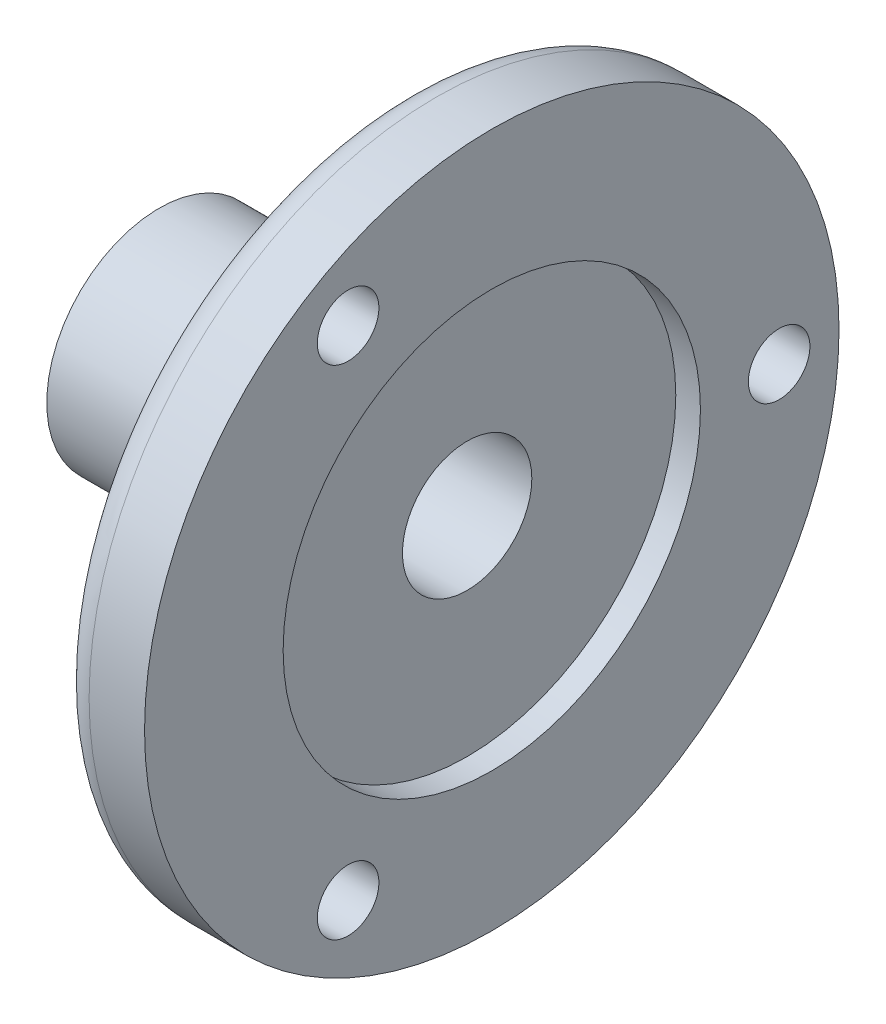
ISO-10303-21;
HEADER;
FILE_DESCRIPTION(('STEP AP214'),'2;1');
FILE_NAME('part.step','',(''),(''),'','','');
FILE_SCHEMA(('AUTOMOTIVE_DESIGN { 1 0 10303 214 1 1 1 1 }'));
ENDSEC;
DATA;
#1=APPLICATION_CONTEXT('core data for automotive mechanical design processes');
#2=APPLICATION_PROTOCOL_DEFINITION('international standard','automotive_design',2000,#1);
#3=PRODUCT_CONTEXT('',#1,'mechanical');
#4=PRODUCT('Part','Part','',(#3));
#5=PRODUCT_RELATED_PRODUCT_CATEGORY('part','',(#4));
#6=PRODUCT_DEFINITION_FORMATION('','',#4);
#7=PRODUCT_DEFINITION_CONTEXT('part definition',#1,'design');
#8=PRODUCT_DEFINITION('design','',#6,#7);
#9=PRODUCT_DEFINITION_SHAPE('','',#8);
#10=(LENGTH_UNIT() NAMED_UNIT(*) SI_UNIT(.MILLI.,.METRE.));
#11=(NAMED_UNIT(*) PLANE_ANGLE_UNIT() SI_UNIT($,.RADIAN.));
#12=(NAMED_UNIT(*) SI_UNIT($,.STERADIAN.) SOLID_ANGLE_UNIT());
#13=UNCERTAINTY_MEASURE_WITH_UNIT(LENGTH_MEASURE(1.E-05),#10,'distance_accuracy_value','');
#14=(GEOMETRIC_REPRESENTATION_CONTEXT(3) GLOBAL_UNCERTAINTY_ASSIGNED_CONTEXT((#13)) GLOBAL_UNIT_ASSIGNED_CONTEXT((#10,
#11,#12)) REPRESENTATION_CONTEXT('',''));
#15=CARTESIAN_POINT('',(0.,0.,0.));
#16=DIRECTION('',(0.,0.,1.));
#17=DIRECTION('',(1.,0.,0.));
#18=AXIS2_PLACEMENT_3D('',#15,#16,#17);
#19=CARTESIAN_POINT('',(10.,0.,0.));
#20=DIRECTION('',(1.,0.,0.));
#21=DIRECTION('',(0.,0.,-1.));
#22=AXIS2_PLACEMENT_3D('',#19,#20,#21);
#23=PLANE('',#22);
#24=CARTESIAN_POINT('',(10.,0.,0.));
#25=DIRECTION('',(1.,0.,0.));
#26=DIRECTION('',(0.,0.,-1.));
#27=AXIS2_PLACEMENT_3D('',#24,#25,#26);
#28=CIRCLE('',#27,2.1);
#29=CARTESIAN_POINT('',(10.,0.,-2.1));
#30=VERTEX_POINT('',#29);
#31=EDGE_CURVE('E74',#30,#30,#28,.T.);
#32=ORIENTED_EDGE('',*,*,#31,.F.);
#33=EDGE_LOOP('',(#32));
#34=FACE_BOUND('',#33,.T.);
#35=CARTESIAN_POINT('',(10.,0.,0.));
#36=DIRECTION('',(1.,0.,0.));
#37=DIRECTION('',(0.,0.,-1.));
#38=AXIS2_PLACEMENT_3D('',#35,#36,#37);
#39=CIRCLE('',#38,6.775);
#40=CARTESIAN_POINT('',(10.,0.,-6.775));
#41=VERTEX_POINT('',#40);
#42=EDGE_CURVE('E84',#41,#41,#39,.T.);
#43=ORIENTED_EDGE('',*,*,#42,.T.);
#44=EDGE_LOOP('',(#43));
#45=FACE_BOUND('',#44,.T.);
#46=ADVANCED_FACE('F54',(#34,#45),#23,.T.);
#47=CARTESIAN_POINT('',(10.,0.,0.));
#48=DIRECTION('',(-1.,0.,0.));
#49=DIRECTION('',(0.,0.,1.));
#50=AXIS2_PLACEMENT_3D('',#47,#48,#49);
#51=CYLINDRICAL_SURFACE('',#50,3.65);
#52=CARTESIAN_POINT('',(0.,0.,0.));
#53=DIRECTION('',(1.,0.,0.));
#54=DIRECTION('',(0.,0.,-1.));
#55=AXIS2_PLACEMENT_3D('',#52,#53,#54);
#56=CIRCLE('',#55,3.65);
#57=CARTESIAN_POINT('',(0.,0.,-3.65));
#58=VERTEX_POINT('',#57);
#59=EDGE_CURVE('E69',#58,#58,#56,.T.);
#60=ORIENTED_EDGE('',*,*,#59,.T.);
#61=EDGE_LOOP('',(#60));
#62=FACE_BOUND('',#61,.T.);
#63=CARTESIAN_POINT('',(8.,0.,0.));
#64=DIRECTION('',(1.,0.,0.));
#65=DIRECTION('',(0.,0.,-1.));
#66=AXIS2_PLACEMENT_3D('',#63,#64,#65);
#67=CIRCLE('',#66,3.65);
#68=CARTESIAN_POINT('',(8.,0.,-3.65));
#69=VERTEX_POINT('',#68);
#70=EDGE_CURVE('E65',#69,#69,#67,.T.);
#71=ORIENTED_EDGE('',*,*,#70,.F.);
#72=EDGE_LOOP('',(#71));
#73=FACE_BOUND('',#72,.T.);
#74=ADVANCED_FACE('F138',(#62,#73),#51,.T.);
#75=CARTESIAN_POINT('',(0.,0.,0.));
#76=DIRECTION('',(1.,0.,0.));
#77=DIRECTION('',(0.,0.,-1.));
#78=AXIS2_PLACEMENT_3D('',#75,#76,#77);
#79=PLANE('',#78);
#80=ORIENTED_EDGE('',*,*,#59,.F.);
#81=EDGE_LOOP('',(#80));
#82=FACE_BOUND('',#81,.T.);
#83=CARTESIAN_POINT('',(0.,0.,0.));
#84=DIRECTION('',(1.,0.,0.));
#85=DIRECTION('',(0.,0.,-1.));
#86=AXIS2_PLACEMENT_3D('',#83,#84,#85);
#87=CIRCLE('',#86,2.1);
#88=CARTESIAN_POINT('',(0.,0.,-2.1));
#89=VERTEX_POINT('',#88);
#90=EDGE_CURVE('E75',#89,#89,#87,.T.);
#91=ORIENTED_EDGE('',*,*,#90,.T.);
#92=EDGE_LOOP('',(#91));
#93=FACE_BOUND('',#92,.T.);
#94=ADVANCED_FACE('F144',(#82,#93),#79,.F.);
#95=CARTESIAN_POINT('',(10.,0.,0.));
#96=DIRECTION('',(-1.,0.,0.));
#97=DIRECTION('',(0.,0.,1.));
#98=AXIS2_PLACEMENT_3D('',#95,#96,#97);
#99=CYLINDRICAL_SURFACE('',#98,2.1);
#100=ORIENTED_EDGE('',*,*,#31,.T.);
#101=EDGE_LOOP('',(#100));
#102=FACE_BOUND('',#101,.T.);
#103=ORIENTED_EDGE('',*,*,#90,.F.);
#104=EDGE_LOOP('',(#103));
#105=FACE_BOUND('',#104,.T.);
#106=ADVANCED_FACE('F149',(#102,#105),#99,.F.);
#107=CARTESIAN_POINT('',(8.,0.,0.));
#108=DIRECTION('',(1.,0.,0.));
#109=DIRECTION('',(0.,0.,-1.));
#110=AXIS2_PLACEMENT_3D('',#107,#108,#109);
#111=PLANE('',#110);
#112=CARTESIAN_POINT('',(8.,0.,0.));
#113=DIRECTION('',(1.,0.,0.));
#114=DIRECTION('',(0.,0.,-1.));
#115=AXIS2_PLACEMENT_3D('',#112,#113,#114);
#116=CIRCLE('',#115,10.275);
#117=CARTESIAN_POINT('',(8.,0.,-10.275));
#118=VERTEX_POINT('',#117);
#119=EDGE_CURVE('E11',#118,#118,#116,.F.);
#120=ORIENTED_EDGE('',*,*,#119,.T.);
#121=EDGE_LOOP('',(#120));
#122=FACE_BOUND('',#121,.T.);
#123=ORIENTED_EDGE('',*,*,#70,.T.);
#124=EDGE_LOOP('',(#123));
#125=FACE_BOUND('',#124,.T.);
#126=ADVANCED_FACE('F156',(#122,#125),#111,.F.);
#127=CARTESIAN_POINT('',(8.,0.,0.));
#128=DIRECTION('',(1.,0.,0.));
#129=DIRECTION('',(0.,0.,-1.));
#130=AXIS2_PLACEMENT_3D('',#127,#128,#129);
#131=CYLINDRICAL_SURFACE('',#130,11.275);
#132=CARTESIAN_POINT('',(9.,0.,0.));
#133=DIRECTION('',(1.,0.,0.));
#134=DIRECTION('',(0.,0.,-1.));
#135=AXIS2_PLACEMENT_3D('',#132,#133,#134);
#136=CIRCLE('',#135,11.275);
#137=CARTESIAN_POINT('',(9.,0.,-11.275));
#138=VERTEX_POINT('',#137);
#139=EDGE_CURVE('E61',#138,#138,#136,.T.);
#140=ORIENTED_EDGE('',*,*,#139,.T.);
#141=EDGE_LOOP('',(#140));
#142=FACE_BOUND('',#141,.T.);
#143=CARTESIAN_POINT('',(10.8,0.,0.));
#144=DIRECTION('',(1.,0.,0.));
#145=DIRECTION('',(0.,0.,-1.));
#146=AXIS2_PLACEMENT_3D('',#143,#144,#145);
#147=CIRCLE('',#146,11.275);
#148=CARTESIAN_POINT('',(10.8,0.,-11.275));
#149=VERTEX_POINT('',#148);
#150=EDGE_CURVE('E78',#149,#149,#147,.T.);
#151=ORIENTED_EDGE('',*,*,#150,.F.);
#152=EDGE_LOOP('',(#151));
#153=FACE_BOUND('',#152,.T.);
#154=ADVANCED_FACE('F121',(#142,#153),#131,.T.);
#155=CARTESIAN_POINT('',(10.8,0.,0.));
#156=DIRECTION('',(1.,0.,0.));
#157=DIRECTION('',(0.,0.,-1.));
#158=AXIS2_PLACEMENT_3D('',#155,#156,#157);
#159=PLANE('',#158);
#160=CARTESIAN_POINT('',(10.8,0.,-9.33));
#161=DIRECTION('',(1.,0.,0.));
#162=DIRECTION('',(0.,0.,-1.));
#163=AXIS2_PLACEMENT_3D('',#160,#161,#162);
#164=CIRCLE('',#163,1.);
#165=CARTESIAN_POINT('',(10.8,0.,-10.33));
#166=VERTEX_POINT('',#165);
#167=EDGE_CURVE('E102',#166,#166,#164,.T.);
#168=ORIENTED_EDGE('',*,*,#167,.F.);
#169=EDGE_LOOP('',(#168));
#170=FACE_BOUND('',#169,.T.);
#171=CARTESIAN_POINT('',(10.8,-8.08001701730882,4.665));
#172=DIRECTION('',(1.,0.,0.));
#173=DIRECTION('',(0.,0.,-1.));
#174=AXIS2_PLACEMENT_3D('',#171,#172,#173);
#175=CIRCLE('',#174,1.);
#176=CARTESIAN_POINT('',(10.8,-8.08001701730882,3.665));
#177=VERTEX_POINT('',#176);
#178=EDGE_CURVE('E99',#177,#177,#175,.T.);
#179=ORIENTED_EDGE('',*,*,#178,.F.);
#180=EDGE_LOOP('',(#179));
#181=FACE_BOUND('',#180,.T.);
#182=CARTESIAN_POINT('',(10.8,8.08001701730881,4.665));
#183=DIRECTION('',(1.,0.,0.));
#184=DIRECTION('',(0.,0.,-1.));
#185=AXIS2_PLACEMENT_3D('',#182,#183,#184);
#186=CIRCLE('',#185,1.);
#187=CARTESIAN_POINT('',(10.8,8.08001701730881,3.665));
#188=VERTEX_POINT('',#187);
#189=EDGE_CURVE('E93',#188,#188,#186,.T.);
#190=ORIENTED_EDGE('',*,*,#189,.F.);
#191=EDGE_LOOP('',(#190));
#192=FACE_BOUND('',#191,.T.);
#193=ORIENTED_EDGE('',*,*,#150,.T.);
#194=EDGE_LOOP('',(#193));
#195=FACE_BOUND('',#194,.T.);
#196=CARTESIAN_POINT('',(10.8,0.,0.));
#197=DIRECTION('',(1.,0.,0.));
#198=DIRECTION('',(0.,0.,-1.));
#199=AXIS2_PLACEMENT_3D('',#196,#197,#198);
#200=CIRCLE('',#199,6.775);
#201=CARTESIAN_POINT('',(10.8,0.,-6.775));
#202=VERTEX_POINT('',#201);
#203=EDGE_CURVE('E83',#202,#202,#200,.T.);
#204=ORIENTED_EDGE('',*,*,#203,.F.);
#205=EDGE_LOOP('',(#204));
#206=FACE_BOUND('',#205,.T.);
#207=ADVANCED_FACE('F117',(#170,#181,#192,#195,#206),#159,.T.);
#208=CARTESIAN_POINT('',(10.8,0.,0.));
#209=DIRECTION('',(-1.,0.,0.));
#210=DIRECTION('',(0.,0.,1.));
#211=AXIS2_PLACEMENT_3D('',#208,#209,#210);
#212=CYLINDRICAL_SURFACE('',#211,6.775);
#213=ORIENTED_EDGE('',*,*,#203,.T.);
#214=EDGE_LOOP('',(#213));
#215=FACE_BOUND('',#214,.T.);
#216=ORIENTED_EDGE('',*,*,#42,.F.);
#217=EDGE_LOOP('',(#216));
#218=FACE_BOUND('',#217,.T.);
#219=ADVANCED_FACE('F120',(#215,#218),#212,.F.);
#220=CARTESIAN_POINT('',(8.05,8.08001701730881,4.665));
#221=DIRECTION('',(1.,0.,0.));
#222=DIRECTION('',(0.,0.,-1.));
#223=AXIS2_PLACEMENT_3D('',#220,#221,#222);
#224=CYLINDRICAL_SURFACE('',#223,1.);
#225=CARTESIAN_POINT('',(8.05,8.08001701730881,4.665));
#226=DIRECTION('',(1.,0.,0.));
#227=DIRECTION('',(0.,0.,-1.));
#228=AXIS2_PLACEMENT_3D('',#225,#226,#227);
#229=CIRCLE('',#228,1.);
#230=CARTESIAN_POINT('',(8.05,8.08001701730881,3.665));
#231=VERTEX_POINT('',#230);
#232=EDGE_CURVE('E90',#231,#231,#229,.T.);
#233=ORIENTED_EDGE('',*,*,#232,.F.);
#234=EDGE_LOOP('',(#233));
#235=FACE_BOUND('',#234,.T.);
#236=ORIENTED_EDGE('',*,*,#189,.T.);
#237=EDGE_LOOP('',(#236));
#238=FACE_BOUND('',#237,.T.);
#239=ADVANCED_FACE('F133',(#235,#238),#224,.F.);
#240=CARTESIAN_POINT('',(8.05,8.08001701730881,4.665));
#241=DIRECTION('',(1.,0.,0.));
#242=DIRECTION('',(0.,0.,-1.));
#243=AXIS2_PLACEMENT_3D('',#240,#241,#242);
#244=PLANE('',#243);
#245=ORIENTED_EDGE('',*,*,#232,.T.);
#246=EDGE_LOOP('',(#245));
#247=FACE_BOUND('',#246,.T.);
#248=ADVANCED_FACE('F171',(#247),#244,.T.);
#249=CARTESIAN_POINT('',(8.05,-8.08001701730882,4.665));
#250=DIRECTION('',(1.,0.,0.));
#251=DIRECTION('',(0.,0.,-1.));
#252=AXIS2_PLACEMENT_3D('',#249,#250,#251);
#253=CYLINDRICAL_SURFACE('',#252,1.);
#254=CARTESIAN_POINT('',(8.05,-8.08001701730882,4.665));
#255=DIRECTION('',(1.,0.,0.));
#256=DIRECTION('',(0.,0.,-1.));
#257=AXIS2_PLACEMENT_3D('',#254,#255,#256);
#258=CIRCLE('',#257,1.);
#259=CARTESIAN_POINT('',(8.05,-8.08001701730882,3.665));
#260=VERTEX_POINT('',#259);
#261=EDGE_CURVE('E96',#260,#260,#258,.T.);
#262=ORIENTED_EDGE('',*,*,#261,.F.);
#263=EDGE_LOOP('',(#262));
#264=FACE_BOUND('',#263,.T.);
#265=ORIENTED_EDGE('',*,*,#178,.T.);
#266=EDGE_LOOP('',(#265));
#267=FACE_BOUND('',#266,.T.);
#268=ADVANCED_FACE('F174',(#264,#267),#253,.F.);
#269=CARTESIAN_POINT('',(8.05,0.,0.));
#270=DIRECTION('',(1.,0.,0.));
#271=DIRECTION('',(0.,0.,-1.));
#272=AXIS2_PLACEMENT_3D('',#269,#270,#271);
#273=PLANE('',#272);
#274=ORIENTED_EDGE('',*,*,#261,.T.);
#275=EDGE_LOOP('',(#274));
#276=FACE_BOUND('',#275,.T.);
#277=ADVANCED_FACE('F113',(#276),#273,.T.);
#278=CARTESIAN_POINT('',(8.05,0.,-9.33));
#279=DIRECTION('',(1.,0.,0.));
#280=DIRECTION('',(0.,0.,-1.));
#281=AXIS2_PLACEMENT_3D('',#278,#279,#280);
#282=CYLINDRICAL_SURFACE('',#281,1.);
#283=CARTESIAN_POINT('',(8.05,0.,-9.33));
#284=DIRECTION('',(1.,0.,0.));
#285=DIRECTION('',(0.,0.,-1.));
#286=AXIS2_PLACEMENT_3D('',#283,#284,#285);
#287=CIRCLE('',#286,1.);
#288=CARTESIAN_POINT('',(8.05,0.,-10.33));
#289=VERTEX_POINT('',#288);
#290=EDGE_CURVE('E87',#289,#289,#287,.T.);
#291=ORIENTED_EDGE('',*,*,#290,.F.);
#292=EDGE_LOOP('',(#291));
#293=FACE_BOUND('',#292,.T.);
#294=ORIENTED_EDGE('',*,*,#167,.T.);
#295=EDGE_LOOP('',(#294));
#296=FACE_BOUND('',#295,.T.);
#297=ADVANCED_FACE('F110',(#293,#296),#282,.F.);
#298=CARTESIAN_POINT('',(8.05,0.,0.));
#299=DIRECTION('',(1.,0.,0.));
#300=DIRECTION('',(0.,0.,-1.));
#301=AXIS2_PLACEMENT_3D('',#298,#299,#300);
#302=PLANE('',#301);
#303=ORIENTED_EDGE('',*,*,#290,.T.);
#304=EDGE_LOOP('',(#303));
#305=FACE_BOUND('',#304,.T.);
#306=ADVANCED_FACE('F108',(#305),#302,.T.);
#307=CARTESIAN_POINT('',(9.,0.,0.));
#308=DIRECTION('',(1.,0.,0.));
#309=DIRECTION('',(0.,0.,-1.));
#310=AXIS2_PLACEMENT_3D('',#307,#308,#309);
#311=TOROIDAL_SURFACE('',#310,10.275,1.);
#312=ORIENTED_EDGE('',*,*,#119,.F.);
#313=EDGE_LOOP('',(#312));
#314=FACE_BOUND('',#313,.T.);
#315=ORIENTED_EDGE('',*,*,#139,.F.);
#316=EDGE_LOOP('',(#315));
#317=FACE_BOUND('',#316,.T.);
#318=ADVANCED_FACE('F56',(#314,#317),#311,.T.);
#319=CLOSED_SHELL('',(#46,#74,#94,#106,#126,#154,#207,#219,#239,#248,#268,#277,#297,#306,#318));
#320=MANIFOLD_SOLID_BREP('B2',#319);
#321=ADVANCED_BREP_SHAPE_REPRESENTATION('',(#18,#320),#14);
#322=SHAPE_DEFINITION_REPRESENTATION(#9,#321);
ENDSEC;
END-ISO-10303-21;
